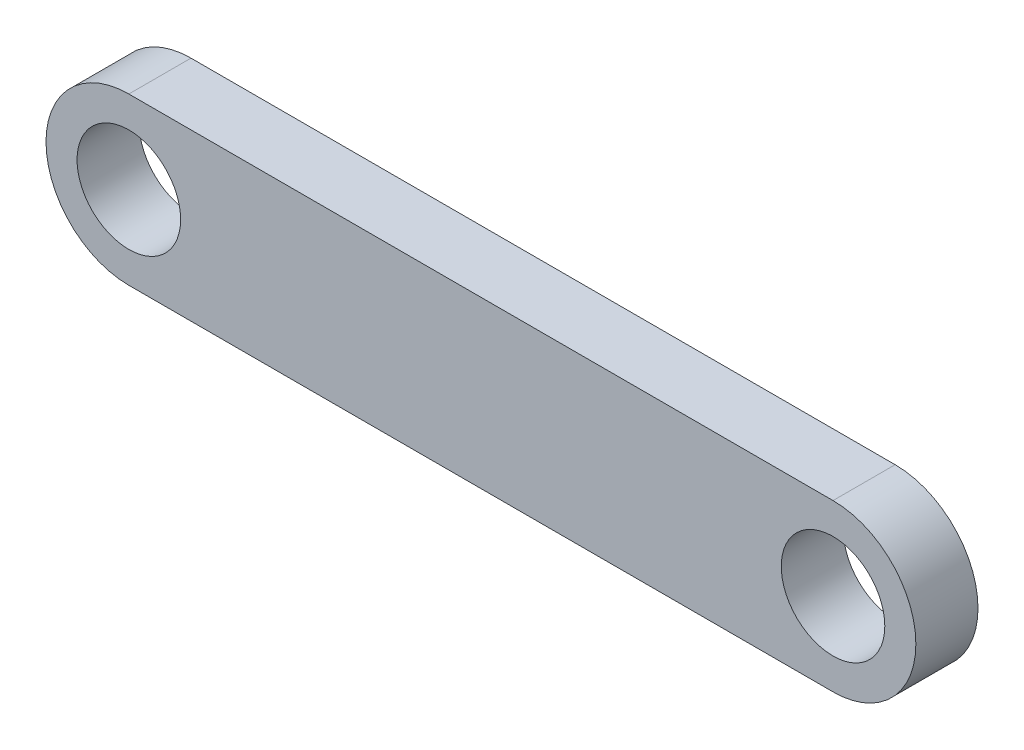
ISO-10303-21;
HEADER;
FILE_DESCRIPTION(('STEP AP214'),'2;1');
FILE_NAME('part.step','',(''),(''),'','','');
FILE_SCHEMA(('AUTOMOTIVE_DESIGN { 1 0 10303 214 1 1 1 1 }'));
ENDSEC;
DATA;
#1=APPLICATION_CONTEXT('core data for automotive mechanical design processes');
#2=APPLICATION_PROTOCOL_DEFINITION('international standard','automotive_design',2000,#1);
#3=PRODUCT_CONTEXT('',#1,'mechanical');
#4=PRODUCT('Part','Part','',(#3));
#5=PRODUCT_RELATED_PRODUCT_CATEGORY('part','',(#4));
#6=PRODUCT_DEFINITION_FORMATION('','',#4);
#7=PRODUCT_DEFINITION_CONTEXT('part definition',#1,'design');
#8=PRODUCT_DEFINITION('design','',#6,#7);
#9=PRODUCT_DEFINITION_SHAPE('','',#8);
#10=(LENGTH_UNIT() NAMED_UNIT(*) SI_UNIT(.MILLI.,.METRE.));
#11=(NAMED_UNIT(*) PLANE_ANGLE_UNIT() SI_UNIT($,.RADIAN.));
#12=(NAMED_UNIT(*) SI_UNIT($,.STERADIAN.) SOLID_ANGLE_UNIT());
#13=UNCERTAINTY_MEASURE_WITH_UNIT(LENGTH_MEASURE(1.E-05),#10,'distance_accuracy_value','');
#14=(GEOMETRIC_REPRESENTATION_CONTEXT(3) GLOBAL_UNCERTAINTY_ASSIGNED_CONTEXT((#13)) GLOBAL_UNIT_ASSIGNED_CONTEXT((#10,
#11,#12)) REPRESENTATION_CONTEXT('',''));
#15=CARTESIAN_POINT('',(0.,0.,0.));
#16=DIRECTION('',(0.,0.,1.));
#17=DIRECTION('',(1.,0.,0.));
#18=AXIS2_PLACEMENT_3D('',#15,#16,#17);
#19=CARTESIAN_POINT('',(0.,0.,3.));
#20=DIRECTION('',(0.,0.,1.));
#21=DIRECTION('',(1.,0.,0.));
#22=AXIS2_PLACEMENT_3D('',#19,#20,#21);
#23=PLANE('',#22);
#24=CARTESIAN_POINT('',(-34.,0.,3.));
#25=DIRECTION('',(0.,0.,1.));
#26=DIRECTION('',(1.,0.,0.));
#27=AXIS2_PLACEMENT_3D('',#24,#25,#26);
#28=CIRCLE('',#27,2.5);
#29=CARTESIAN_POINT('',(-31.5,0.,3.));
#30=VERTEX_POINT('',#29);
#31=EDGE_CURVE('E101',#30,#30,#28,.T.);
#32=ORIENTED_EDGE('',*,*,#31,.F.);
#33=EDGE_LOOP('',(#32));
#34=FACE_BOUND('',#33,.T.);
#35=CARTESIAN_POINT('',(0.,0.,3.));
#36=DIRECTION('',(0.,0.,1.));
#37=DIRECTION('',(1.,0.,0.));
#38=AXIS2_PLACEMENT_3D('',#35,#36,#37);
#39=CIRCLE('',#38,4.);
#40=CARTESIAN_POINT('',(0.,-4.,3.));
#41=VERTEX_POINT('',#40);
#42=CARTESIAN_POINT('',(0.,4.,3.));
#43=VERTEX_POINT('',#42);
#44=EDGE_CURVE('E86',#41,#43,#39,.T.);
#45=ORIENTED_EDGE('',*,*,#44,.T.);
#46=DIRECTION('',(-1.,0.,0.));
#47=VECTOR('',#46,1.);
#48=CARTESIAN_POINT('',(-34.,4.,3.));
#49=LINE('',#48,#47);
#50=CARTESIAN_POINT('',(-34.,4.,3.));
#51=VERTEX_POINT('',#50);
#52=EDGE_CURVE('E81',#43,#51,#49,.T.);
#53=ORIENTED_EDGE('',*,*,#52,.T.);
#54=CARTESIAN_POINT('',(-34.,0.,3.));
#55=DIRECTION('',(0.,0.,1.));
#56=DIRECTION('',(1.,0.,0.));
#57=AXIS2_PLACEMENT_3D('',#54,#55,#56);
#58=CIRCLE('',#57,4.);
#59=CARTESIAN_POINT('',(-34.,-4.,3.));
#60=VERTEX_POINT('',#59);
#61=EDGE_CURVE('E84',#51,#60,#58,.T.);
#62=ORIENTED_EDGE('',*,*,#61,.T.);
#63=DIRECTION('',(1.,0.,0.));
#64=VECTOR('',#63,1.);
#65=CARTESIAN_POINT('',(-34.,-4.,3.));
#66=LINE('',#65,#64);
#67=EDGE_CURVE('E51',#60,#41,#66,.T.);
#68=ORIENTED_EDGE('',*,*,#67,.T.);
#69=EDGE_LOOP('',(#45,#53,#62,#68));
#70=FACE_BOUND('',#69,.T.);
#71=CARTESIAN_POINT('',(0.,0.,3.));
#72=DIRECTION('',(0.,0.,1.));
#73=DIRECTION('',(1.,0.,0.));
#74=AXIS2_PLACEMENT_3D('',#71,#72,#73);
#75=CIRCLE('',#74,2.5);
#76=CARTESIAN_POINT('',(2.5,0.,3.));
#77=VERTEX_POINT('',#76);
#78=EDGE_CURVE('E116',#77,#77,#75,.T.);
#79=ORIENTED_EDGE('',*,*,#78,.F.);
#80=EDGE_LOOP('',(#79));
#81=FACE_BOUND('',#80,.T.);
#82=ADVANCED_FACE('F34',(#34,#70,#81),#23,.T.);
#83=CARTESIAN_POINT('',(0.,0.,0.));
#84=DIRECTION('',(0.,0.,1.));
#85=DIRECTION('',(1.,0.,0.));
#86=AXIS2_PLACEMENT_3D('',#83,#84,#85);
#87=PLANE('',#86);
#88=CARTESIAN_POINT('',(0.,0.,0.));
#89=DIRECTION('',(0.,0.,1.));
#90=DIRECTION('',(1.,0.,0.));
#91=AXIS2_PLACEMENT_3D('',#88,#89,#90);
#92=CIRCLE('',#91,4.);
#93=CARTESIAN_POINT('',(0.,-4.,0.));
#94=VERTEX_POINT('',#93);
#95=CARTESIAN_POINT('',(0.,4.,0.));
#96=VERTEX_POINT('',#95);
#97=EDGE_CURVE('E98',#94,#96,#92,.T.);
#98=ORIENTED_EDGE('',*,*,#97,.F.);
#99=DIRECTION('',(1.,0.,0.));
#100=VECTOR('',#99,1.);
#101=CARTESIAN_POINT('',(-34.,-4.,0.));
#102=LINE('',#101,#100);
#103=CARTESIAN_POINT('',(-34.,-4.,0.));
#104=VERTEX_POINT('',#103);
#105=EDGE_CURVE('E74',#104,#94,#102,.T.);
#106=ORIENTED_EDGE('',*,*,#105,.F.);
#107=CARTESIAN_POINT('',(-34.,0.,0.));
#108=DIRECTION('',(0.,0.,1.));
#109=DIRECTION('',(1.,0.,0.));
#110=AXIS2_PLACEMENT_3D('',#107,#108,#109);
#111=CIRCLE('',#110,4.);
#112=CARTESIAN_POINT('',(-34.,4.,0.));
#113=VERTEX_POINT('',#112);
#114=EDGE_CURVE('E68',#113,#104,#111,.T.);
#115=ORIENTED_EDGE('',*,*,#114,.F.);
#116=DIRECTION('',(-1.,0.,0.));
#117=VECTOR('',#116,1.);
#118=CARTESIAN_POINT('',(-34.,4.,0.));
#119=LINE('',#118,#117);
#120=EDGE_CURVE('E90',#96,#113,#119,.T.);
#121=ORIENTED_EDGE('',*,*,#120,.F.);
#122=EDGE_LOOP('',(#98,#106,#115,#121));
#123=FACE_BOUND('',#122,.T.);
#124=CARTESIAN_POINT('',(-34.,0.,0.));
#125=DIRECTION('',(0.,0.,1.));
#126=DIRECTION('',(1.,0.,0.));
#127=AXIS2_PLACEMENT_3D('',#124,#125,#126);
#128=CIRCLE('',#127,2.5);
#129=CARTESIAN_POINT('',(-31.5,0.,0.));
#130=VERTEX_POINT('',#129);
#131=EDGE_CURVE('E113',#130,#130,#128,.T.);
#132=ORIENTED_EDGE('',*,*,#131,.T.);
#133=EDGE_LOOP('',(#132));
#134=FACE_BOUND('',#133,.T.);
#135=CARTESIAN_POINT('',(0.,0.,0.));
#136=DIRECTION('',(0.,0.,1.));
#137=DIRECTION('',(1.,0.,0.));
#138=AXIS2_PLACEMENT_3D('',#135,#136,#137);
#139=CIRCLE('',#138,2.5);
#140=CARTESIAN_POINT('',(2.5,0.,0.));
#141=VERTEX_POINT('',#140);
#142=EDGE_CURVE('E119',#141,#141,#139,.T.);
#143=ORIENTED_EDGE('',*,*,#142,.T.);
#144=EDGE_LOOP('',(#143));
#145=FACE_BOUND('',#144,.T.);
#146=ADVANCED_FACE('F109',(#123,#134,#145),#87,.F.);
#147=CARTESIAN_POINT('',(0.,0.,3.));
#148=DIRECTION('',(0.,0.,-1.));
#149=DIRECTION('',(-1.,0.,0.));
#150=AXIS2_PLACEMENT_3D('',#147,#148,#149);
#151=CYLINDRICAL_SURFACE('',#150,4.);
#152=ORIENTED_EDGE('',*,*,#97,.T.);
#153=DIRECTION('',(0.,0.,-1.));
#154=VECTOR('',#153,1.);
#155=CARTESIAN_POINT('',(0.,4.,3.));
#156=LINE('',#155,#154);
#157=EDGE_CURVE('E11',#43,#96,#156,.T.);
#158=ORIENTED_EDGE('',*,*,#157,.F.);
#159=ORIENTED_EDGE('',*,*,#44,.F.);
#160=DIRECTION('',(0.,0.,-1.));
#161=VECTOR('',#160,1.);
#162=CARTESIAN_POINT('',(0.,-4.,3.));
#163=LINE('',#162,#161);
#164=EDGE_CURVE('E94',#41,#94,#163,.T.);
#165=ORIENTED_EDGE('',*,*,#164,.T.);
#166=EDGE_LOOP('',(#152,#158,#159,#165));
#167=FACE_BOUND('',#166,.T.);
#168=ADVANCED_FACE('F36',(#167),#151,.T.);
#169=CARTESIAN_POINT('',(-34.,4.,3.));
#170=DIRECTION('',(0.,-1.,0.));
#171=DIRECTION('',(1.,0.,0.));
#172=AXIS2_PLACEMENT_3D('',#169,#170,#171);
#173=PLANE('',#172);
#174=ORIENTED_EDGE('',*,*,#120,.T.);
#175=DIRECTION('',(0.,0.,-1.));
#176=VECTOR('',#175,1.);
#177=CARTESIAN_POINT('',(-34.,4.,3.));
#178=LINE('',#177,#176);
#179=EDGE_CURVE('E43',#51,#113,#178,.T.);
#180=ORIENTED_EDGE('',*,*,#179,.F.);
#181=ORIENTED_EDGE('',*,*,#52,.F.);
#182=ORIENTED_EDGE('',*,*,#157,.T.);
#183=EDGE_LOOP('',(#174,#180,#181,#182));
#184=FACE_BOUND('',#183,.T.);
#185=ADVANCED_FACE('F89',(#184),#173,.F.);
#186=CARTESIAN_POINT('',(-34.,0.,3.));
#187=DIRECTION('',(0.,0.,-1.));
#188=DIRECTION('',(-1.,0.,0.));
#189=AXIS2_PLACEMENT_3D('',#186,#187,#188);
#190=CYLINDRICAL_SURFACE('',#189,4.);
#191=ORIENTED_EDGE('',*,*,#114,.T.);
#192=DIRECTION('',(0.,0.,-1.));
#193=VECTOR('',#192,1.);
#194=CARTESIAN_POINT('',(-34.,-4.,3.));
#195=LINE('',#194,#193);
#196=EDGE_CURVE('E91',#60,#104,#195,.T.);
#197=ORIENTED_EDGE('',*,*,#196,.F.);
#198=ORIENTED_EDGE('',*,*,#61,.F.);
#199=ORIENTED_EDGE('',*,*,#179,.T.);
#200=EDGE_LOOP('',(#191,#197,#198,#199));
#201=FACE_BOUND('',#200,.T.);
#202=ADVANCED_FACE('F92',(#201),#190,.T.);
#203=CARTESIAN_POINT('',(-34.,-4.,3.));
#204=DIRECTION('',(0.,1.,0.));
#205=DIRECTION('',(-1.,0.,0.));
#206=AXIS2_PLACEMENT_3D('',#203,#204,#205);
#207=PLANE('',#206);
#208=ORIENTED_EDGE('',*,*,#105,.T.);
#209=ORIENTED_EDGE('',*,*,#164,.F.);
#210=ORIENTED_EDGE('',*,*,#67,.F.);
#211=ORIENTED_EDGE('',*,*,#196,.T.);
#212=EDGE_LOOP('',(#208,#209,#210,#211));
#213=FACE_BOUND('',#212,.T.);
#214=ADVANCED_FACE('F106',(#213),#207,.F.);
#215=CARTESIAN_POINT('',(-34.,0.,3.));
#216=DIRECTION('',(0.,0.,-1.));
#217=DIRECTION('',(-1.,0.,0.));
#218=AXIS2_PLACEMENT_3D('',#215,#216,#217);
#219=CYLINDRICAL_SURFACE('',#218,2.5);
#220=ORIENTED_EDGE('',*,*,#31,.T.);
#221=EDGE_LOOP('',(#220));
#222=FACE_BOUND('',#221,.T.);
#223=ORIENTED_EDGE('',*,*,#131,.F.);
#224=EDGE_LOOP('',(#223));
#225=FACE_BOUND('',#224,.T.);
#226=ADVANCED_FACE('F136',(#222,#225),#219,.F.);
#227=CARTESIAN_POINT('',(0.,0.,3.));
#228=DIRECTION('',(0.,0.,-1.));
#229=DIRECTION('',(-1.,0.,0.));
#230=AXIS2_PLACEMENT_3D('',#227,#228,#229);
#231=CYLINDRICAL_SURFACE('',#230,2.5);
#232=ORIENTED_EDGE('',*,*,#78,.T.);
#233=EDGE_LOOP('',(#232));
#234=FACE_BOUND('',#233,.T.);
#235=ORIENTED_EDGE('',*,*,#142,.F.);
#236=EDGE_LOOP('',(#235));
#237=FACE_BOUND('',#236,.T.);
#238=ADVANCED_FACE('F125',(#234,#237),#231,.F.);
#239=CLOSED_SHELL('',(#82,#146,#168,#185,#202,#214,#226,#238));
#240=MANIFOLD_SOLID_BREP('B2',#239);
#241=ADVANCED_BREP_SHAPE_REPRESENTATION('',(#18,#240),#14);
#242=SHAPE_DEFINITION_REPRESENTATION(#9,#241);
ENDSEC;
END-ISO-10303-21;
